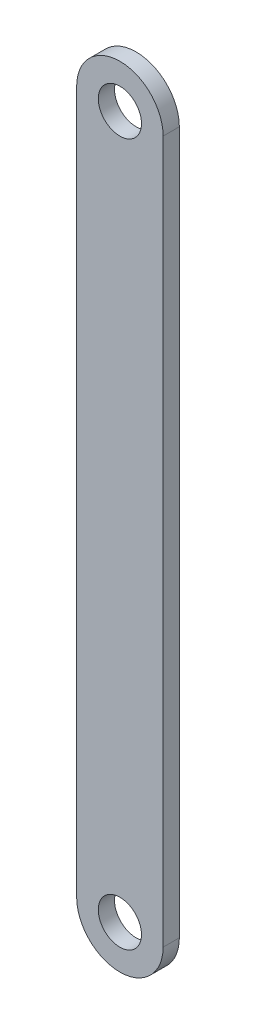
ISO-10303-21;
HEADER;
FILE_DESCRIPTION(('STEP AP214'),'2;1');
FILE_NAME('part.step','',(''),(''),'','','');
FILE_SCHEMA(('AUTOMOTIVE_DESIGN { 1 0 10303 214 1 1 1 1 }'));
ENDSEC;
DATA;
#1=APPLICATION_CONTEXT('core data for automotive mechanical design processes');
#2=APPLICATION_PROTOCOL_DEFINITION('international standard','automotive_design',2000,#1);
#3=PRODUCT_CONTEXT('',#1,'mechanical');
#4=PRODUCT('Part','Part','',(#3));
#5=PRODUCT_RELATED_PRODUCT_CATEGORY('part','',(#4));
#6=PRODUCT_DEFINITION_FORMATION('','',#4);
#7=PRODUCT_DEFINITION_CONTEXT('part definition',#1,'design');
#8=PRODUCT_DEFINITION('design','',#6,#7);
#9=PRODUCT_DEFINITION_SHAPE('','',#8);
#10=(LENGTH_UNIT() NAMED_UNIT(*) SI_UNIT(.MILLI.,.METRE.));
#11=(NAMED_UNIT(*) PLANE_ANGLE_UNIT() SI_UNIT($,.RADIAN.));
#12=(NAMED_UNIT(*) SI_UNIT($,.STERADIAN.) SOLID_ANGLE_UNIT());
#13=UNCERTAINTY_MEASURE_WITH_UNIT(LENGTH_MEASURE(1.E-05),#10,'distance_accuracy_value','');
#14=(GEOMETRIC_REPRESENTATION_CONTEXT(3) GLOBAL_UNCERTAINTY_ASSIGNED_CONTEXT((#13)) GLOBAL_UNIT_ASSIGNED_CONTEXT((#10,
#11,#12)) REPRESENTATION_CONTEXT('',''));
#15=CARTESIAN_POINT('',(0.,0.,0.));
#16=DIRECTION('',(0.,0.,1.));
#17=DIRECTION('',(1.,0.,0.));
#18=AXIS2_PLACEMENT_3D('',#15,#16,#17);
#19=CARTESIAN_POINT('',(-8.58823529411763,0.,1.5));
#20=DIRECTION('',(0.,0.,-1.));
#21=DIRECTION('',(-1.,0.,0.));
#22=AXIS2_PLACEMENT_3D('',#19,#20,#21);
#23=CYLINDRICAL_SURFACE('',#22,4.);
#24=CARTESIAN_POINT('',(-8.58823529411763,0.,0.));
#25=DIRECTION('',(0.,0.,1.));
#26=DIRECTION('',(-1.,0.,0.));
#27=AXIS2_PLACEMENT_3D('',#24,#25,#26);
#28=CIRCLE('',#27,4.);
#29=CARTESIAN_POINT('',(-4.58823529411763,0.,0.));
#30=VERTEX_POINT('',#29);
#31=CARTESIAN_POINT('',(-12.5882352941176,0.,0.));
#32=VERTEX_POINT('',#31);
#33=EDGE_CURVE('E120',#30,#32,#28,.T.);
#34=ORIENTED_EDGE('',*,*,#33,.T.);
#35=DIRECTION('',(0.,0.,-1.));
#36=VECTOR('',#35,1.);
#37=CARTESIAN_POINT('',(-12.5882352941176,0.,1.5));
#38=LINE('',#37,#36);
#39=CARTESIAN_POINT('',(-12.5882352941176,0.,1.5));
#40=VERTEX_POINT('',#39);
#41=EDGE_CURVE('E11',#40,#32,#38,.T.);
#42=ORIENTED_EDGE('',*,*,#41,.F.);
#43=CARTESIAN_POINT('',(-8.58823529411763,0.,1.5));
#44=DIRECTION('',(0.,0.,1.));
#45=DIRECTION('',(-1.,0.,0.));
#46=AXIS2_PLACEMENT_3D('',#43,#44,#45);
#47=CIRCLE('',#46,4.);
#48=CARTESIAN_POINT('',(-4.58823529411763,0.,1.5));
#49=VERTEX_POINT('',#48);
#50=EDGE_CURVE('E103',#49,#40,#47,.T.);
#51=ORIENTED_EDGE('',*,*,#50,.F.);
#52=DIRECTION('',(0.,0.,-1.));
#53=VECTOR('',#52,1.);
#54=CARTESIAN_POINT('',(-4.58823529411763,0.,1.5));
#55=LINE('',#54,#53);
#56=EDGE_CURVE('E116',#49,#30,#55,.T.);
#57=ORIENTED_EDGE('',*,*,#56,.T.);
#58=EDGE_LOOP('',(#34,#42,#51,#57));
#59=FACE_BOUND('',#58,.T.);
#60=ADVANCED_FACE('F49',(#59),#23,.T.);
#61=CARTESIAN_POINT('',(-12.5882352941176,0.,1.5));
#62=DIRECTION('',(1.,0.,0.));
#63=DIRECTION('',(0.,1.,0.));
#64=AXIS2_PLACEMENT_3D('',#61,#62,#63);
#65=PLANE('',#64);
#66=DIRECTION('',(0.,-1.,0.));
#67=VECTOR('',#66,1.);
#68=CARTESIAN_POINT('',(-12.5882352941176,0.,0.));
#69=LINE('',#68,#67);
#70=CARTESIAN_POINT('',(-12.5882352941176,-65.,0.));
#71=VERTEX_POINT('',#70);
#72=EDGE_CURVE('E108',#32,#71,#69,.T.);
#73=ORIENTED_EDGE('',*,*,#72,.T.);
#74=DIRECTION('',(0.,0.,-1.));
#75=VECTOR('',#74,1.);
#76=CARTESIAN_POINT('',(-12.5882352941176,-65.,1.5));
#77=LINE('',#76,#75);
#78=CARTESIAN_POINT('',(-12.5882352941176,-65.,1.5));
#79=VERTEX_POINT('',#78);
#80=EDGE_CURVE('E59',#79,#71,#77,.T.);
#81=ORIENTED_EDGE('',*,*,#80,.F.);
#82=DIRECTION('',(0.,-1.,0.));
#83=VECTOR('',#82,1.);
#84=CARTESIAN_POINT('',(-12.5882352941176,0.,1.5));
#85=LINE('',#84,#83);
#86=EDGE_CURVE('E98',#40,#79,#85,.T.);
#87=ORIENTED_EDGE('',*,*,#86,.F.);
#88=ORIENTED_EDGE('',*,*,#41,.T.);
#89=EDGE_LOOP('',(#73,#81,#87,#88));
#90=FACE_BOUND('',#89,.T.);
#91=ADVANCED_FACE('F107',(#90),#65,.F.);
#92=CARTESIAN_POINT('',(-8.58823529411762,-65.,1.5));
#93=DIRECTION('',(0.,0.,-1.));
#94=DIRECTION('',(-1.,0.,0.));
#95=AXIS2_PLACEMENT_3D('',#92,#93,#94);
#96=CYLINDRICAL_SURFACE('',#95,4.);
#97=CARTESIAN_POINT('',(-8.58823529411762,-65.,0.));
#98=DIRECTION('',(0.,0.,1.));
#99=DIRECTION('',(1.,0.,0.));
#100=AXIS2_PLACEMENT_3D('',#97,#98,#99);
#101=CIRCLE('',#100,4.);
#102=CARTESIAN_POINT('',(-4.58823529411762,-65.,0.));
#103=VERTEX_POINT('',#102);
#104=EDGE_CURVE('E85',#71,#103,#101,.T.);
#105=ORIENTED_EDGE('',*,*,#104,.T.);
#106=DIRECTION('',(0.,0.,-1.));
#107=VECTOR('',#106,1.);
#108=CARTESIAN_POINT('',(-4.58823529411762,-65.,1.5));
#109=LINE('',#108,#107);
#110=CARTESIAN_POINT('',(-4.58823529411762,-65.,1.5));
#111=VERTEX_POINT('',#110);
#112=EDGE_CURVE('E110',#111,#103,#109,.T.);
#113=ORIENTED_EDGE('',*,*,#112,.F.);
#114=CARTESIAN_POINT('',(-8.58823529411762,-65.,1.5));
#115=DIRECTION('',(0.,0.,1.));
#116=DIRECTION('',(1.,0.,0.));
#117=AXIS2_PLACEMENT_3D('',#114,#115,#116);
#118=CIRCLE('',#117,4.);
#119=EDGE_CURVE('E101',#79,#111,#118,.T.);
#120=ORIENTED_EDGE('',*,*,#119,.F.);
#121=ORIENTED_EDGE('',*,*,#80,.T.);
#122=EDGE_LOOP('',(#105,#113,#120,#121));
#123=FACE_BOUND('',#122,.T.);
#124=ADVANCED_FACE('F112',(#123),#96,.T.);
#125=CARTESIAN_POINT('',(-4.58823529411763,0.,1.5));
#126=DIRECTION('',(-1.,0.,0.));
#127=DIRECTION('',(0.,-1.,0.));
#128=AXIS2_PLACEMENT_3D('',#125,#126,#127);
#129=PLANE('',#128);
#130=DIRECTION('',(0.,1.,0.));
#131=VECTOR('',#130,1.);
#132=CARTESIAN_POINT('',(-4.58823529411763,0.,0.));
#133=LINE('',#132,#131);
#134=EDGE_CURVE('E91',#103,#30,#133,.T.);
#135=ORIENTED_EDGE('',*,*,#134,.T.);
#136=ORIENTED_EDGE('',*,*,#56,.F.);
#137=DIRECTION('',(0.,1.,0.));
#138=VECTOR('',#137,1.);
#139=CARTESIAN_POINT('',(-4.58823529411763,0.,1.5));
#140=LINE('',#139,#138);
#141=EDGE_CURVE('E68',#111,#49,#140,.T.);
#142=ORIENTED_EDGE('',*,*,#141,.F.);
#143=ORIENTED_EDGE('',*,*,#112,.T.);
#144=EDGE_LOOP('',(#135,#136,#142,#143));
#145=FACE_BOUND('',#144,.T.);
#146=ADVANCED_FACE('F157',(#145),#129,.F.);
#147=CARTESIAN_POINT('',(-8.58823529411763,0.,1.5));
#148=DIRECTION('',(0.,0.,-1.));
#149=DIRECTION('',(-1.,0.,0.));
#150=AXIS2_PLACEMENT_3D('',#147,#148,#149);
#151=PLANE('',#150);
#152=CARTESIAN_POINT('',(-8.58823529411763,0.,1.5));
#153=DIRECTION('',(0.,0.,1.));
#154=DIRECTION('',(1.,0.,0.));
#155=AXIS2_PLACEMENT_3D('',#152,#153,#154);
#156=CIRCLE('',#155,2.);
#157=CARTESIAN_POINT('',(-6.58823529411763,0.,1.5));
#158=VERTEX_POINT('',#157);
#159=EDGE_CURVE('E136',#158,#158,#156,.T.);
#160=ORIENTED_EDGE('',*,*,#159,.F.);
#161=EDGE_LOOP('',(#160));
#162=FACE_BOUND('',#161,.T.);
#163=CARTESIAN_POINT('',(-8.58823529411762,-65.,1.5));
#164=DIRECTION('',(0.,0.,1.));
#165=DIRECTION('',(1.,0.,0.));
#166=AXIS2_PLACEMENT_3D('',#163,#164,#165);
#167=CIRCLE('',#166,2.);
#168=CARTESIAN_POINT('',(-6.58823529411762,-65.,1.5));
#169=VERTEX_POINT('',#168);
#170=EDGE_CURVE('E143',#169,#169,#167,.T.);
#171=ORIENTED_EDGE('',*,*,#170,.F.);
#172=EDGE_LOOP('',(#171));
#173=FACE_BOUND('',#172,.T.);
#174=ORIENTED_EDGE('',*,*,#50,.T.);
#175=ORIENTED_EDGE('',*,*,#86,.T.);
#176=ORIENTED_EDGE('',*,*,#119,.T.);
#177=ORIENTED_EDGE('',*,*,#141,.T.);
#178=EDGE_LOOP('',(#174,#175,#176,#177));
#179=FACE_BOUND('',#178,.T.);
#180=ADVANCED_FACE('F99',(#162,#173,#179),#151,.F.);
#181=CARTESIAN_POINT('',(-8.58823529411763,0.,0.));
#182=DIRECTION('',(0.,0.,-1.));
#183=DIRECTION('',(-1.,0.,0.));
#184=AXIS2_PLACEMENT_3D('',#181,#182,#183);
#185=PLANE('',#184);
#186=CARTESIAN_POINT('',(-8.58823529411763,0.,0.));
#187=DIRECTION('',(0.,0.,-1.));
#188=DIRECTION('',(-1.,0.,0.));
#189=AXIS2_PLACEMENT_3D('',#186,#187,#188);
#190=CIRCLE('',#189,2.);
#191=CARTESIAN_POINT('',(-10.5882352941176,0.,0.));
#192=VERTEX_POINT('',#191);
#193=EDGE_CURVE('E52',#192,#192,#190,.T.);
#194=ORIENTED_EDGE('',*,*,#193,.F.);
#195=EDGE_LOOP('',(#194));
#196=FACE_BOUND('',#195,.T.);
#197=CARTESIAN_POINT('',(-8.58823529411762,-65.,0.));
#198=DIRECTION('',(0.,0.,-1.));
#199=DIRECTION('',(-1.,0.,0.));
#200=AXIS2_PLACEMENT_3D('',#197,#198,#199);
#201=CIRCLE('',#200,2.);
#202=CARTESIAN_POINT('',(-10.5882352941176,-65.,0.));
#203=VERTEX_POINT('',#202);
#204=EDGE_CURVE('E133',#203,#203,#201,.T.);
#205=ORIENTED_EDGE('',*,*,#204,.F.);
#206=EDGE_LOOP('',(#205));
#207=FACE_BOUND('',#206,.T.);
#208=ORIENTED_EDGE('',*,*,#33,.F.);
#209=ORIENTED_EDGE('',*,*,#134,.F.);
#210=ORIENTED_EDGE('',*,*,#104,.F.);
#211=ORIENTED_EDGE('',*,*,#72,.F.);
#212=EDGE_LOOP('',(#208,#209,#210,#211));
#213=FACE_BOUND('',#212,.T.);
#214=ADVANCED_FACE('F156',(#196,#207,#213),#185,.T.);
#215=CARTESIAN_POINT('',(-8.58823529411762,-65.,-0.5));
#216=DIRECTION('',(0.,0.,1.));
#217=DIRECTION('',(1.,0.,0.));
#218=AXIS2_PLACEMENT_3D('',#215,#216,#217);
#219=CYLINDRICAL_SURFACE('',#218,2.);
#220=ORIENTED_EDGE('',*,*,#204,.T.);
#221=EDGE_LOOP('',(#220));
#222=FACE_BOUND('',#221,.T.);
#223=ORIENTED_EDGE('',*,*,#170,.T.);
#224=EDGE_LOOP('',(#223));
#225=FACE_BOUND('',#224,.T.);
#226=ADVANCED_FACE('F153',(#222,#225),#219,.F.);
#227=CARTESIAN_POINT('',(-8.58823529411763,0.,-0.5));
#228=DIRECTION('',(0.,0.,1.));
#229=DIRECTION('',(1.,0.,0.));
#230=AXIS2_PLACEMENT_3D('',#227,#228,#229);
#231=CYLINDRICAL_SURFACE('',#230,2.);
#232=ORIENTED_EDGE('',*,*,#193,.T.);
#233=EDGE_LOOP('',(#232));
#234=FACE_BOUND('',#233,.T.);
#235=ORIENTED_EDGE('',*,*,#159,.T.);
#236=EDGE_LOOP('',(#235));
#237=FACE_BOUND('',#236,.T.);
#238=ADVANCED_FACE('F204',(#234,#237),#231,.F.);
#239=CLOSED_SHELL('',(#60,#91,#124,#146,#180,#214,#226,#238));
#240=MANIFOLD_SOLID_BREP('B2',#239);
#241=ADVANCED_BREP_SHAPE_REPRESENTATION('',(#18,#240),#14);
#242=SHAPE_DEFINITION_REPRESENTATION(#9,#241);
ENDSEC;
END-ISO-10303-21;
